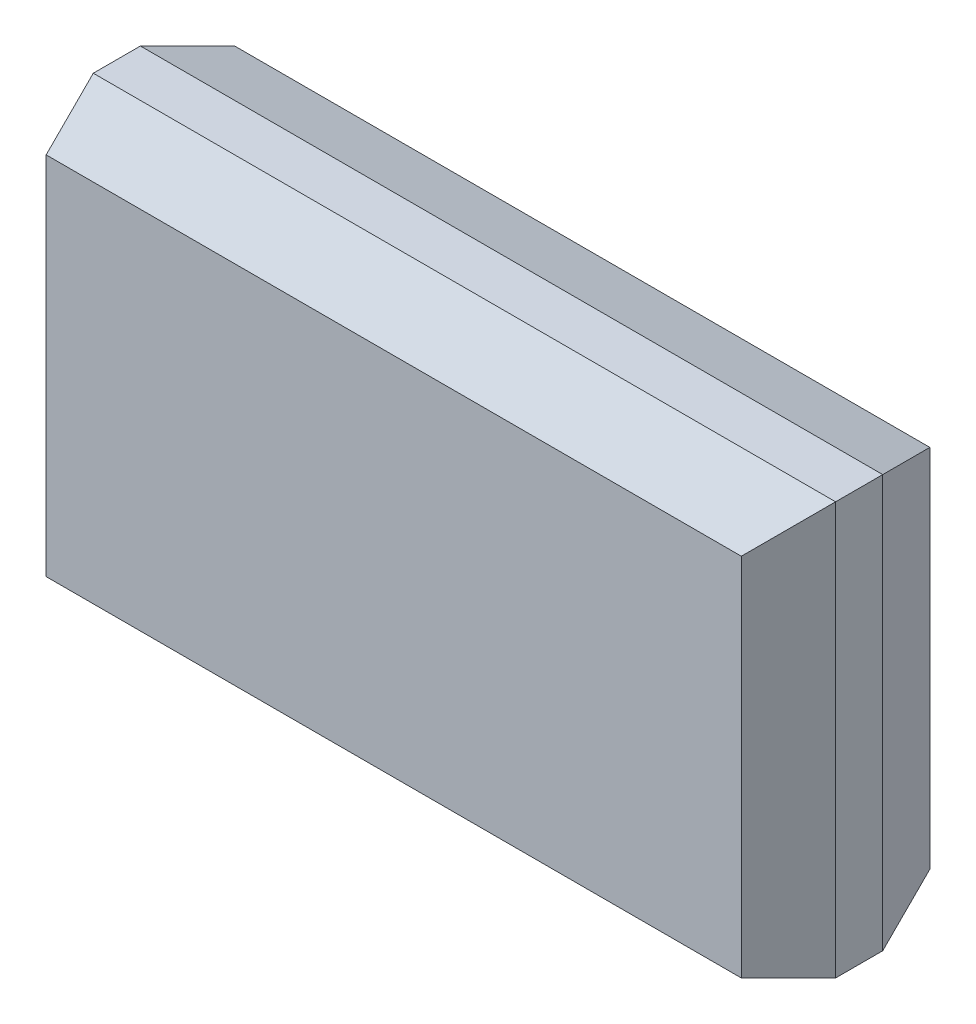
ISO-10303-21;
HEADER;
FILE_DESCRIPTION(('STEP AP214'),'2;1');
FILE_NAME('part.step','',(''),(''),'','','');
FILE_SCHEMA(('AUTOMOTIVE_DESIGN { 1 0 10303 214 1 1 1 1 }'));
ENDSEC;
DATA;
#1=APPLICATION_CONTEXT('core data for automotive mechanical design processes');
#2=APPLICATION_PROTOCOL_DEFINITION('international standard','automotive_design',2000,#1);
#3=PRODUCT_CONTEXT('',#1,'mechanical');
#4=PRODUCT('Part','Part','',(#3));
#5=PRODUCT_RELATED_PRODUCT_CATEGORY('part','',(#4));
#6=PRODUCT_DEFINITION_FORMATION('','',#4);
#7=PRODUCT_DEFINITION_CONTEXT('part definition',#1,'design');
#8=PRODUCT_DEFINITION('design','',#6,#7);
#9=PRODUCT_DEFINITION_SHAPE('','',#8);
#10=(LENGTH_UNIT() NAMED_UNIT(*) SI_UNIT(.MILLI.,.METRE.));
#11=(NAMED_UNIT(*) PLANE_ANGLE_UNIT() SI_UNIT($,.RADIAN.));
#12=(NAMED_UNIT(*) SI_UNIT($,.STERADIAN.) SOLID_ANGLE_UNIT());
#13=UNCERTAINTY_MEASURE_WITH_UNIT(LENGTH_MEASURE(1.E-05),#10,'distance_accuracy_value','');
#14=(GEOMETRIC_REPRESENTATION_CONTEXT(3) GLOBAL_UNCERTAINTY_ASSIGNED_CONTEXT((#13)) GLOBAL_UNIT_ASSIGNED_CONTEXT((#10,
#11,#12)) REPRESENTATION_CONTEXT('',''));
#15=CARTESIAN_POINT('',(0.,0.,0.));
#16=DIRECTION('',(0.,0.,1.));
#17=DIRECTION('',(1.,0.,0.));
#18=AXIS2_PLACEMENT_3D('',#15,#16,#17);
#19=CARTESIAN_POINT('',(0.,0.,1.6));
#20=DIRECTION('',(0.,0.,1.));
#21=DIRECTION('',(1.,0.,0.));
#22=AXIS2_PLACEMENT_3D('',#19,#20,#21);
#23=PLANE('',#22);
#24=DIRECTION('',(1.,0.,0.));
#25=VECTOR('',#24,1.);
#26=CARTESIAN_POINT('',(3.15,-1.55,1.6));
#27=LINE('',#26,#25);
#28=CARTESIAN_POINT('',(2.95,-1.55,1.6));
#29=VERTEX_POINT('',#28);
#30=CARTESIAN_POINT('',(-2.95,-1.55,1.6));
#31=VERTEX_POINT('',#30);
#32=EDGE_CURVE('E79',#29,#31,#27,.F.);
#33=ORIENTED_EDGE('',*,*,#32,.F.);
#34=DIRECTION('',(0.,1.,0.));
#35=VECTOR('',#34,1.);
#36=CARTESIAN_POINT('',(2.95,1.75,1.6));
#37=LINE('',#36,#35);
#38=CARTESIAN_POINT('',(2.95,1.55,1.6));
#39=VERTEX_POINT('',#38);
#40=EDGE_CURVE('E94',#39,#29,#37,.F.);
#41=ORIENTED_EDGE('',*,*,#40,.F.);
#42=DIRECTION('',(1.,0.,0.));
#43=VECTOR('',#42,1.);
#44=CARTESIAN_POINT('',(-3.15,1.55,1.6));
#45=LINE('',#44,#43);
#46=CARTESIAN_POINT('',(-2.95,1.55,1.6));
#47=VERTEX_POINT('',#46);
#48=EDGE_CURVE('E20',#47,#39,#45,.T.);
#49=ORIENTED_EDGE('',*,*,#48,.F.);
#50=DIRECTION('',(0.,1.,0.));
#51=VECTOR('',#50,1.);
#52=CARTESIAN_POINT('',(-2.95,-1.75,1.6));
#53=LINE('',#52,#51);
#54=EDGE_CURVE('E84',#31,#47,#53,.T.);
#55=ORIENTED_EDGE('',*,*,#54,.F.);
#56=EDGE_LOOP('',(#33,#41,#49,#55));
#57=FACE_BOUND('',#56,.T.);
#58=ADVANCED_FACE('F17',(#57),#23,.T.);
#59=CARTESIAN_POINT('',(-3.15,1.65,1.3));
#60=DIRECTION('',(0.,0.948683298050514,0.316227766016838));
#61=DIRECTION('',(0.,-0.316227766016838,0.948683298050514));
#62=AXIS2_PLACEMENT_3D('',#59,#60,#61);
#63=PLANE('',#62);
#64=DIRECTION('',(1.,0.,0.));
#65=VECTOR('',#64,1.);
#66=CARTESIAN_POINT('',(-3.15,1.75,1.));
#67=LINE('',#66,#65);
#68=CARTESIAN_POINT('',(-3.15,1.75,1.));
#69=VERTEX_POINT('',#68);
#70=CARTESIAN_POINT('',(3.15,1.75,1.));
#71=VERTEX_POINT('',#70);
#72=EDGE_CURVE('E100',#69,#71,#67,.T.);
#73=ORIENTED_EDGE('',*,*,#72,.F.);
#74=DIRECTION('',(-0.301511344577764,0.301511344577764,-0.904534033733291));
#75=VECTOR('',#74,1.);
#76=CARTESIAN_POINT('',(-2.95,1.55,1.6));
#77=LINE('',#76,#75);
#78=EDGE_CURVE('E89',#47,#69,#77,.T.);
#79=ORIENTED_EDGE('',*,*,#78,.F.);
#80=ORIENTED_EDGE('',*,*,#48,.T.);
#81=DIRECTION('',(-0.301511344577764,-0.301511344577764,0.904534033733291));
#82=VECTOR('',#81,1.);
#83=CARTESIAN_POINT('',(3.15,1.75,1.));
#84=LINE('',#83,#82);
#85=EDGE_CURVE('E109',#71,#39,#84,.T.);
#86=ORIENTED_EDGE('',*,*,#85,.F.);
#87=EDGE_LOOP('',(#73,#79,#80,#86));
#88=FACE_BOUND('',#87,.T.);
#89=ADVANCED_FACE('F99',(#88),#63,.T.);
#90=CARTESIAN_POINT('',(-3.05,-1.75,1.3));
#91=DIRECTION('',(-0.948683298050514,0.,0.316227766016838));
#92=DIRECTION('',(0.316227766016838,0.,0.948683298050514));
#93=AXIS2_PLACEMENT_3D('',#90,#91,#92);
#94=PLANE('',#93);
#95=DIRECTION('',(0.,1.,0.));
#96=VECTOR('',#95,1.);
#97=CARTESIAN_POINT('',(-3.15,-1.75,1.));
#98=LINE('',#97,#96);
#99=CARTESIAN_POINT('',(-3.15,-1.75,1.));
#100=VERTEX_POINT('',#99);
#101=EDGE_CURVE('E112',#100,#69,#98,.T.);
#102=ORIENTED_EDGE('',*,*,#101,.F.);
#103=DIRECTION('',(-0.301511344577763,-0.301511344577764,-0.904534033733291));
#104=VECTOR('',#103,1.);
#105=CARTESIAN_POINT('',(-2.95,-1.55,1.6));
#106=LINE('',#105,#104);
#107=EDGE_CURVE('E91',#31,#100,#106,.T.);
#108=ORIENTED_EDGE('',*,*,#107,.F.);
#109=ORIENTED_EDGE('',*,*,#54,.T.);
#110=ORIENTED_EDGE('',*,*,#78,.T.);
#111=EDGE_LOOP('',(#102,#108,#109,#110));
#112=FACE_BOUND('',#111,.T.);
#113=ADVANCED_FACE('F87',(#112),#94,.T.);
#114=CARTESIAN_POINT('',(3.15,-1.65,1.3));
#115=DIRECTION('',(0.,-0.948683298050514,0.316227766016838));
#116=DIRECTION('',(0.,-0.316227766016838,-0.948683298050514));
#117=AXIS2_PLACEMENT_3D('',#114,#115,#116);
#118=PLANE('',#117);
#119=DIRECTION('',(1.,0.,0.));
#120=VECTOR('',#119,1.);
#121=CARTESIAN_POINT('',(3.15,-1.75,1.));
#122=LINE('',#121,#120);
#123=CARTESIAN_POINT('',(3.15,-1.75,1.));
#124=VERTEX_POINT('',#123);
#125=EDGE_CURVE('E116',#124,#100,#122,.F.);
#126=ORIENTED_EDGE('',*,*,#125,.F.);
#127=DIRECTION('',(0.301511344577764,-0.301511344577764,-0.904534033733291));
#128=VECTOR('',#127,1.);
#129=CARTESIAN_POINT('',(2.95,-1.55,1.6));
#130=LINE('',#129,#128);
#131=EDGE_CURVE('E107',#29,#124,#130,.T.);
#132=ORIENTED_EDGE('',*,*,#131,.F.);
#133=ORIENTED_EDGE('',*,*,#32,.T.);
#134=ORIENTED_EDGE('',*,*,#107,.T.);
#135=EDGE_LOOP('',(#126,#132,#133,#134));
#136=FACE_BOUND('',#135,.T.);
#137=ADVANCED_FACE('F206',(#136),#118,.T.);
#138=CARTESIAN_POINT('',(3.05,1.75,1.3));
#139=DIRECTION('',(0.948683298050514,0.,0.316227766016838));
#140=DIRECTION('',(0.316227766016838,0.,-0.948683298050514));
#141=AXIS2_PLACEMENT_3D('',#138,#139,#140);
#142=PLANE('',#141);
#143=DIRECTION('',(0.,1.,0.));
#144=VECTOR('',#143,1.);
#145=CARTESIAN_POINT('',(3.15,1.75,1.));
#146=LINE('',#145,#144);
#147=EDGE_CURVE('E124',#71,#124,#146,.F.);
#148=ORIENTED_EDGE('',*,*,#147,.F.);
#149=ORIENTED_EDGE('',*,*,#85,.T.);
#150=ORIENTED_EDGE('',*,*,#40,.T.);
#151=ORIENTED_EDGE('',*,*,#131,.T.);
#152=EDGE_LOOP('',(#148,#149,#150,#151));
#153=FACE_BOUND('',#152,.T.);
#154=ADVANCED_FACE('F202',(#153),#142,.T.);
#155=CARTESIAN_POINT('',(-3.15,1.75,0.));
#156=DIRECTION('',(0.,1.,0.));
#157=DIRECTION('',(0.,0.,1.));
#158=AXIS2_PLACEMENT_3D('',#155,#156,#157);
#159=PLANE('',#158);
#160=DIRECTION('',(0.,0.,-1.));
#161=VECTOR('',#160,1.);
#162=CARTESIAN_POINT('',(3.15,1.75,0.));
#163=LINE('',#162,#161);
#164=CARTESIAN_POINT('',(3.15,1.75,0.6));
#165=VERTEX_POINT('',#164);
#166=EDGE_CURVE('E121',#165,#71,#163,.F.);
#167=ORIENTED_EDGE('',*,*,#166,.F.);
#168=DIRECTION('',(1.,0.,0.));
#169=VECTOR('',#168,1.);
#170=CARTESIAN_POINT('',(-3.15,1.75,0.6));
#171=LINE('',#170,#169);
#172=CARTESIAN_POINT('',(-3.15,1.75,0.6));
#173=VERTEX_POINT('',#172);
#174=EDGE_CURVE('E129',#165,#173,#171,.F.);
#175=ORIENTED_EDGE('',*,*,#174,.T.);
#176=DIRECTION('',(0.,0.,1.));
#177=VECTOR('',#176,1.);
#178=CARTESIAN_POINT('',(-3.15,1.75,0.));
#179=LINE('',#178,#177);
#180=EDGE_CURVE('E114',#69,#173,#179,.F.);
#181=ORIENTED_EDGE('',*,*,#180,.F.);
#182=ORIENTED_EDGE('',*,*,#72,.T.);
#183=EDGE_LOOP('',(#167,#175,#181,#182));
#184=FACE_BOUND('',#183,.T.);
#185=ADVANCED_FACE('F198',(#184),#159,.T.);
#186=CARTESIAN_POINT('',(-3.15,-1.75,0.));
#187=DIRECTION('',(-1.,0.,0.));
#188=DIRECTION('',(0.,0.,1.));
#189=AXIS2_PLACEMENT_3D('',#186,#187,#188);
#190=PLANE('',#189);
#191=ORIENTED_EDGE('',*,*,#180,.T.);
#192=DIRECTION('',(0.,1.,0.));
#193=VECTOR('',#192,1.);
#194=CARTESIAN_POINT('',(-3.15,-1.75,0.6));
#195=LINE('',#194,#193);
#196=CARTESIAN_POINT('',(-3.15,-1.75,0.6));
#197=VERTEX_POINT('',#196);
#198=EDGE_CURVE('E135',#173,#197,#195,.F.);
#199=ORIENTED_EDGE('',*,*,#198,.T.);
#200=DIRECTION('',(0.,0.,-1.));
#201=VECTOR('',#200,1.);
#202=CARTESIAN_POINT('',(-3.15,-1.75,0.));
#203=LINE('',#202,#201);
#204=EDGE_CURVE('E119',#100,#197,#203,.T.);
#205=ORIENTED_EDGE('',*,*,#204,.F.);
#206=ORIENTED_EDGE('',*,*,#101,.T.);
#207=EDGE_LOOP('',(#191,#199,#205,#206));
#208=FACE_BOUND('',#207,.T.);
#209=ADVANCED_FACE('F194',(#208),#190,.T.);
#210=CARTESIAN_POINT('',(3.15,-1.75,0.));
#211=DIRECTION('',(0.,-1.,0.));
#212=DIRECTION('',(0.,0.,-1.));
#213=AXIS2_PLACEMENT_3D('',#210,#211,#212);
#214=PLANE('',#213);
#215=ORIENTED_EDGE('',*,*,#204,.T.);
#216=DIRECTION('',(1.,0.,0.));
#217=VECTOR('',#216,1.);
#218=CARTESIAN_POINT('',(3.15,-1.75,0.6));
#219=LINE('',#218,#217);
#220=CARTESIAN_POINT('',(3.15,-1.75,0.6));
#221=VERTEX_POINT('',#220);
#222=EDGE_CURVE('E141',#197,#221,#219,.T.);
#223=ORIENTED_EDGE('',*,*,#222,.T.);
#224=DIRECTION('',(0.,0.,-1.));
#225=VECTOR('',#224,1.);
#226=CARTESIAN_POINT('',(3.15,-1.75,0.));
#227=LINE('',#226,#225);
#228=EDGE_CURVE('E127',#124,#221,#227,.T.);
#229=ORIENTED_EDGE('',*,*,#228,.F.);
#230=ORIENTED_EDGE('',*,*,#125,.T.);
#231=EDGE_LOOP('',(#215,#223,#229,#230));
#232=FACE_BOUND('',#231,.T.);
#233=ADVANCED_FACE('F190',(#232),#214,.T.);
#234=CARTESIAN_POINT('',(3.15,1.75,0.));
#235=DIRECTION('',(1.,0.,0.));
#236=DIRECTION('',(0.,0.,-1.));
#237=AXIS2_PLACEMENT_3D('',#234,#235,#236);
#238=PLANE('',#237);
#239=ORIENTED_EDGE('',*,*,#228,.T.);
#240=DIRECTION('',(0.,1.,0.));
#241=VECTOR('',#240,1.);
#242=CARTESIAN_POINT('',(3.15,1.75,0.6));
#243=LINE('',#242,#241);
#244=EDGE_CURVE('E145',#221,#165,#243,.T.);
#245=ORIENTED_EDGE('',*,*,#244,.T.);
#246=ORIENTED_EDGE('',*,*,#166,.T.);
#247=ORIENTED_EDGE('',*,*,#147,.T.);
#248=EDGE_LOOP('',(#239,#245,#246,#247));
#249=FACE_BOUND('',#248,.T.);
#250=ADVANCED_FACE('F187',(#249),#238,.T.);
#251=CARTESIAN_POINT('',(-3.15,1.65,0.3));
#252=DIRECTION('',(0.,-0.948683298050514,0.316227766016838));
#253=DIRECTION('',(0.,-0.316227766016838,-0.948683298050514));
#254=AXIS2_PLACEMENT_3D('',#251,#252,#253);
#255=PLANE('',#254);
#256=ORIENTED_EDGE('',*,*,#174,.F.);
#257=DIRECTION('',(-0.301511344577763,-0.301511344577764,-0.904534033733291));
#258=VECTOR('',#257,1.);
#259=CARTESIAN_POINT('',(3.15,1.75,0.6));
#260=LINE('',#259,#258);
#261=CARTESIAN_POINT('',(2.95,1.55,0.));
#262=VERTEX_POINT('',#261);
#263=EDGE_CURVE('E148',#165,#262,#260,.T.);
#264=ORIENTED_EDGE('',*,*,#263,.T.);
#265=DIRECTION('',(1.,0.,0.));
#266=VECTOR('',#265,1.);
#267=CARTESIAN_POINT('',(0.,1.55,0.));
#268=LINE('',#267,#266);
#269=CARTESIAN_POINT('',(-2.95,1.55,0.));
#270=VERTEX_POINT('',#269);
#271=EDGE_CURVE('E151',#262,#270,#268,.F.);
#272=ORIENTED_EDGE('',*,*,#271,.T.);
#273=DIRECTION('',(-0.301511344577763,0.301511344577764,0.904534033733291));
#274=VECTOR('',#273,1.);
#275=CARTESIAN_POINT('',(-2.95,1.55,0.));
#276=LINE('',#275,#274);
#277=EDGE_CURVE('E132',#270,#173,#276,.T.);
#278=ORIENTED_EDGE('',*,*,#277,.T.);
#279=EDGE_LOOP('',(#256,#264,#272,#278));
#280=FACE_BOUND('',#279,.T.);
#281=ADVANCED_FACE('F169',(#280),#255,.F.);
#282=CARTESIAN_POINT('',(-3.05,-1.75,0.3));
#283=DIRECTION('',(0.948683298050514,0.,0.316227766016838));
#284=DIRECTION('',(0.316227766016838,0.,-0.948683298050514));
#285=AXIS2_PLACEMENT_3D('',#282,#283,#284);
#286=PLANE('',#285);
#287=ORIENTED_EDGE('',*,*,#198,.F.);
#288=ORIENTED_EDGE('',*,*,#277,.F.);
#289=DIRECTION('',(0.,1.,0.));
#290=VECTOR('',#289,1.);
#291=CARTESIAN_POINT('',(-2.95,0.,0.));
#292=LINE('',#291,#290);
#293=CARTESIAN_POINT('',(-2.95,-1.55,0.));
#294=VERTEX_POINT('',#293);
#295=EDGE_CURVE('E154',#270,#294,#292,.F.);
#296=ORIENTED_EDGE('',*,*,#295,.T.);
#297=DIRECTION('',(-0.301511344577763,-0.301511344577764,0.904534033733291));
#298=VECTOR('',#297,1.);
#299=CARTESIAN_POINT('',(-2.95,-1.55,0.));
#300=LINE('',#299,#298);
#301=EDGE_CURVE('E138',#294,#197,#300,.T.);
#302=ORIENTED_EDGE('',*,*,#301,.T.);
#303=EDGE_LOOP('',(#287,#288,#296,#302));
#304=FACE_BOUND('',#303,.T.);
#305=ADVANCED_FACE('F167',(#304),#286,.F.);
#306=CARTESIAN_POINT('',(3.15,-1.65,0.3));
#307=DIRECTION('',(0.,0.948683298050514,0.316227766016838));
#308=DIRECTION('',(0.,-0.316227766016838,0.948683298050514));
#309=AXIS2_PLACEMENT_3D('',#306,#307,#308);
#310=PLANE('',#309);
#311=ORIENTED_EDGE('',*,*,#222,.F.);
#312=ORIENTED_EDGE('',*,*,#301,.F.);
#313=DIRECTION('',(1.,0.,0.));
#314=VECTOR('',#313,1.);
#315=CARTESIAN_POINT('',(0.,-1.55,0.));
#316=LINE('',#315,#314);
#317=CARTESIAN_POINT('',(2.95,-1.55,0.));
#318=VERTEX_POINT('',#317);
#319=EDGE_CURVE('E26',#294,#318,#316,.T.);
#320=ORIENTED_EDGE('',*,*,#319,.T.);
#321=DIRECTION('',(0.301511344577763,-0.301511344577764,0.904534033733291));
#322=VECTOR('',#321,1.);
#323=CARTESIAN_POINT('',(2.95,-1.55,0.));
#324=LINE('',#323,#322);
#325=EDGE_CURVE('E34',#318,#221,#324,.T.);
#326=ORIENTED_EDGE('',*,*,#325,.T.);
#327=EDGE_LOOP('',(#311,#312,#320,#326));
#328=FACE_BOUND('',#327,.T.);
#329=ADVANCED_FACE('F161',(#328),#310,.F.);
#330=CARTESIAN_POINT('',(3.05,1.75,0.3));
#331=DIRECTION('',(-0.948683298050514,0.,0.316227766016838));
#332=DIRECTION('',(0.316227766016838,0.,0.948683298050514));
#333=AXIS2_PLACEMENT_3D('',#330,#331,#332);
#334=PLANE('',#333);
#335=ORIENTED_EDGE('',*,*,#244,.F.);
#336=ORIENTED_EDGE('',*,*,#325,.F.);
#337=DIRECTION('',(0.,1.,0.));
#338=VECTOR('',#337,1.);
#339=CARTESIAN_POINT('',(2.95,0.,0.));
#340=LINE('',#339,#338);
#341=EDGE_CURVE('E11',#318,#262,#340,.T.);
#342=ORIENTED_EDGE('',*,*,#341,.T.);
#343=ORIENTED_EDGE('',*,*,#263,.F.);
#344=EDGE_LOOP('',(#335,#336,#342,#343));
#345=FACE_BOUND('',#344,.T.);
#346=ADVANCED_FACE('F172',(#345),#334,.F.);
#347=CARTESIAN_POINT('',(0.,0.,0.));
#348=DIRECTION('',(0.,0.,1.));
#349=DIRECTION('',(1.,0.,0.));
#350=AXIS2_PLACEMENT_3D('',#347,#348,#349);
#351=PLANE('',#350);
#352=ORIENTED_EDGE('',*,*,#319,.F.);
#353=ORIENTED_EDGE('',*,*,#295,.F.);
#354=ORIENTED_EDGE('',*,*,#271,.F.);
#355=ORIENTED_EDGE('',*,*,#341,.F.);
#356=EDGE_LOOP('',(#352,#353,#354,#355));
#357=FACE_BOUND('',#356,.T.);
#358=ADVANCED_FACE('F164',(#357),#351,.F.);
#359=CLOSED_SHELL('',(#58,#89,#113,#137,#154,#185,#209,#233,#250,#281,#305,#329,#346,#358));
#360=MANIFOLD_SOLID_BREP('B1',#359);
#361=ADVANCED_BREP_SHAPE_REPRESENTATION('',(#18,#360),#14);
#362=SHAPE_DEFINITION_REPRESENTATION(#9,#361);
ENDSEC;
END-ISO-10303-21;
